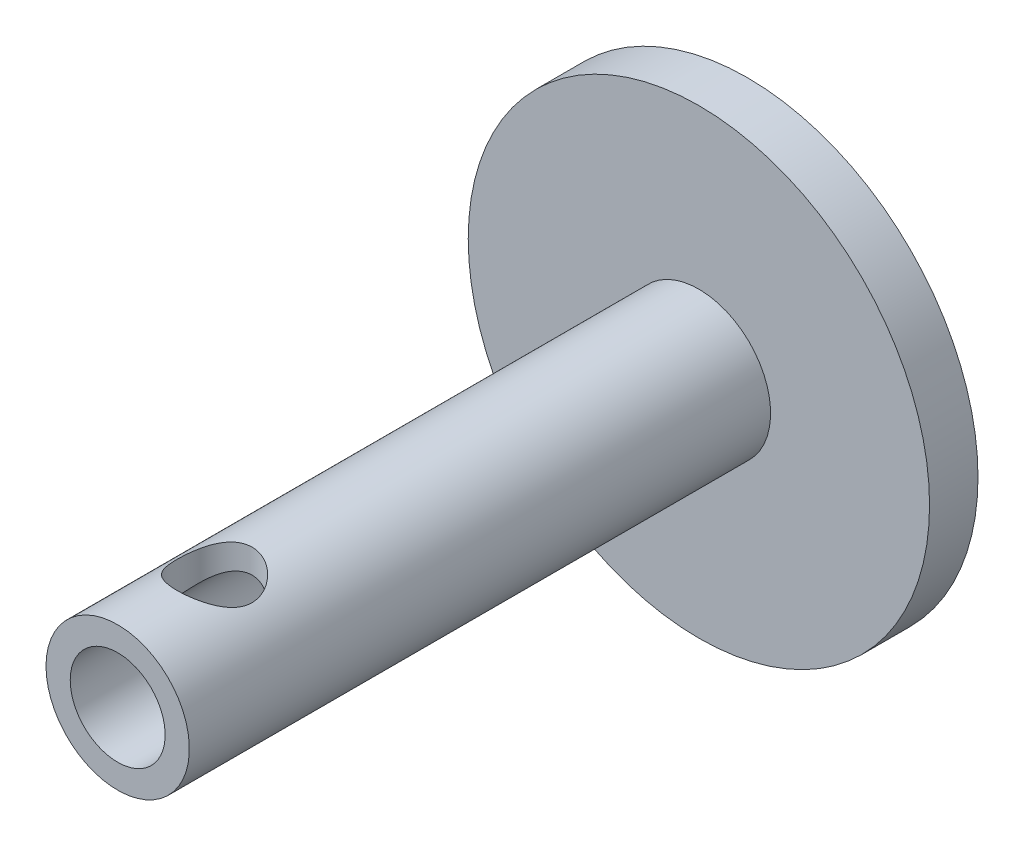
ISO-10303-21;
HEADER;
FILE_DESCRIPTION(('STEP AP214'),'2;1');
FILE_NAME('part.step','',(''),(''),'','','');
FILE_SCHEMA(('AUTOMOTIVE_DESIGN { 1 0 10303 214 1 1 1 1 }'));
ENDSEC;
DATA;
#1=APPLICATION_CONTEXT('core data for automotive mechanical design processes');
#2=APPLICATION_PROTOCOL_DEFINITION('international standard','automotive_design',2000,#1);
#3=PRODUCT_CONTEXT('',#1,'mechanical');
#4=PRODUCT('Part','Part','',(#3));
#5=PRODUCT_RELATED_PRODUCT_CATEGORY('part','',(#4));
#6=PRODUCT_DEFINITION_FORMATION('','',#4);
#7=PRODUCT_DEFINITION_CONTEXT('part definition',#1,'design');
#8=PRODUCT_DEFINITION('design','',#6,#7);
#9=PRODUCT_DEFINITION_SHAPE('','',#8);
#10=(LENGTH_UNIT() NAMED_UNIT(*) SI_UNIT(.MILLI.,.METRE.));
#11=(NAMED_UNIT(*) PLANE_ANGLE_UNIT() SI_UNIT($,.RADIAN.));
#12=(NAMED_UNIT(*) SI_UNIT($,.STERADIAN.) SOLID_ANGLE_UNIT());
#13=UNCERTAINTY_MEASURE_WITH_UNIT(LENGTH_MEASURE(1.E-05),#10,'distance_accuracy_value','');
#14=(GEOMETRIC_REPRESENTATION_CONTEXT(3) GLOBAL_UNCERTAINTY_ASSIGNED_CONTEXT((#13)) GLOBAL_UNIT_ASSIGNED_CONTEXT((#10,
#11,#12)) REPRESENTATION_CONTEXT('',''));
#15=CARTESIAN_POINT('',(0.,0.,0.));
#16=DIRECTION('',(0.,0.,1.));
#17=DIRECTION('',(1.,0.,0.));
#18=AXIS2_PLACEMENT_3D('',#15,#16,#17);
#19=CARTESIAN_POINT('',(2.96,0.,24.));
#20=DIRECTION('',(0.,0.,-1.));
#21=DIRECTION('',(-1.,0.,0.));
#22=AXIS2_PLACEMENT_3D('',#19,#20,#21);
#23=PLANE('',#22);
#24=CARTESIAN_POINT('',(0.,0.,24.));
#25=DIRECTION('',(0.,0.,-1.));
#26=DIRECTION('',(-1.,0.,0.));
#27=AXIS2_PLACEMENT_3D('',#24,#25,#26);
#28=CIRCLE('',#27,2.96);
#29=CARTESIAN_POINT('',(-2.96,0.,24.));
#30=VERTEX_POINT('',#29);
#31=EDGE_CURVE('E122',#30,#30,#28,.T.);
#32=ORIENTED_EDGE('',*,*,#31,.F.);
#33=EDGE_LOOP('',(#32));
#34=FACE_BOUND('',#33,.T.);
#35=CARTESIAN_POINT('',(0.,0.,24.));
#36=DIRECTION('',(0.,0.,-1.));
#37=DIRECTION('',(-1.,0.,0.));
#38=AXIS2_PLACEMENT_3D('',#35,#36,#37);
#39=CIRCLE('',#38,1.96);
#40=CARTESIAN_POINT('',(-1.96,0.,24.));
#41=VERTEX_POINT('',#40);
#42=EDGE_CURVE('E51',#41,#41,#39,.T.);
#43=ORIENTED_EDGE('',*,*,#42,.T.);
#44=EDGE_LOOP('',(#43));
#45=FACE_BOUND('',#44,.T.);
#46=ADVANCED_FACE('F40',(#34,#45),#23,.F.);
#47=CARTESIAN_POINT('',(0.,0.,-2.));
#48=DIRECTION('',(0.,0.,-1.));
#49=DIRECTION('',(-1.,0.,0.));
#50=AXIS2_PLACEMENT_3D('',#47,#48,#49);
#51=CYLINDRICAL_SURFACE('',#50,1.96);
#52=CARTESIAN_POINT('',(0.,-1.96,21.55));
#53=CARTESIAN_POINT('',(-0.0746568045734328,-1.95999397400661,21.5499937838936));
#54=CARTESIAN_POINT('',(-0.149405391044742,-1.95569132095657,21.544562636242));
#55=CARTESIAN_POINT('',(-0.296493778049111,-1.93886565327968,21.523201047049));
#56=CARTESIAN_POINT('',(-0.368828725940991,-1.92632701689851,21.5072506526988));
#57=CARTESIAN_POINT('',(-0.508578278205111,-1.89421707066767,21.4659895208645));
#58=CARTESIAN_POINT('',(-0.576020372064933,-1.87468942407518,21.4407368704287));
#59=CARTESIAN_POINT('',(-0.705199414167387,-1.83002053238323,21.3821120204705));
#60=CARTESIAN_POINT('',(-0.766935895288857,-1.8048788282329,21.3487391569535));
#61=CARTESIAN_POINT('',(-0.904156365864112,-1.74115210952124,21.2623935578558));
#62=CARTESIAN_POINT('',(-0.977110743456854,-1.70091151865726,21.2066222617887));
#63=CARTESIAN_POINT('',(-1.11115864773021,-1.61654700414325,21.0844759704547));
#64=CARTESIAN_POINT('',(-1.17221723465961,-1.57241217813069,21.018070752302));
#65=CARTESIAN_POINT('',(-1.28286906288937,-1.48355771556415,20.8746927321344));
#66=CARTESIAN_POINT('',(-1.33227708612719,-1.43883920943189,20.7975766803363));
#67=CARTESIAN_POINT('',(-1.41759039303436,-1.35483741094282,20.6335868593087));
#68=CARTESIAN_POINT('',(-1.45354186613012,-1.31553582416967,20.5467478230313));
#69=CARTESIAN_POINT('',(-1.49810764747785,-1.26408843541495,20.4016086105696));
#70=CARTESIAN_POINT('',(-1.51187011224514,-1.24745252027821,20.346506017504));
#71=CARTESIAN_POINT('',(-1.53336623458263,-1.22093472226132,20.2336109096542));
#72=CARTESIAN_POINT('',(-1.54111442409937,-1.21103656649417,20.1758252385064));
#73=CARTESIAN_POINT('',(-1.55002347780994,-1.19962031776102,20.0584108456369));
#74=CARTESIAN_POINT('',(-1.55113172169234,-1.19816916828634,19.9987711568037));
#75=CARTESIAN_POINT('',(-1.54650422373792,-1.20413213262265,19.8801851920153));
#76=CARTESIAN_POINT('',(-1.54076181518098,-1.21155488209317,19.821239647979));
#77=CARTESIAN_POINT('',(-1.52142261053495,-1.23577624089895,19.6959256483089));
#78=CARTESIAN_POINT('',(-1.50664638639496,-1.25396599656985,19.6300207096244));
#79=CARTESIAN_POINT('',(-1.46956571199885,-1.29722226068151,19.5027067436442));
#80=CARTESIAN_POINT('',(-1.44723961138571,-1.32230850666038,19.4413112712449));
#81=CARTESIAN_POINT('',(-1.38404978718874,-1.38886933009948,19.2958753970852));
#82=CARTESIAN_POINT('',(-1.33938897307981,-1.4325546162818,19.2145085550018));
#83=CARTESIAN_POINT('',(-1.23705792031506,-1.5218186659776,19.0615652845649));
#84=CARTESIAN_POINT('',(-1.17936997457548,-1.56739993715683,18.990002396929));
#85=CARTESIAN_POINT('',(-1.04991010592864,-1.65699357794198,18.8558587770496));
#86=CARTESIAN_POINT('',(-0.977858787770961,-1.70095015100397,18.7935076354175));
#87=CARTESIAN_POINT('',(-0.821011669328597,-1.78193160069085,18.6818012247973));
#88=CARTESIAN_POINT('',(-0.736251993269533,-1.81897547777325,18.6324101766437));
#89=CARTESIAN_POINT('',(-0.581953673262459,-1.87284042123239,18.5616725747236));
#90=CARTESIAN_POINT('',(-0.515192235655196,-1.89240825249774,18.536348186648));
#91=CARTESIAN_POINT('',(-0.377273322478689,-1.92464627299882,18.4948969822355));
#92=CARTESIAN_POINT('',(-0.306119239549992,-1.93732171312852,18.4787631637148));
#93=CARTESIAN_POINT('',(-0.160931569625636,-1.95475531922086,18.4566220759572));
#94=CARTESIAN_POINT('',(-0.0868861438551919,-1.9594764406653,18.4506621866267));
#95=CARTESIAN_POINT('',(0.0613495342411641,-1.96044038015338,18.44944299547));
#96=CARTESIAN_POINT('',(0.135539773324839,-1.95668394017379,18.4541827571842));
#97=CARTESIAN_POINT('',(0.276324492055145,-1.941622658479,18.4732947008915));
#98=CARTESIAN_POINT('',(0.343080918968177,-1.93088167713264,18.4869476274579));
#99=CARTESIAN_POINT('',(0.473030422831981,-1.90322347006205,18.5224065761335));
#100=CARTESIAN_POINT('',(0.536222640841211,-1.88630476284256,18.5442145539555));
#101=CARTESIAN_POINT('',(0.662300463497124,-1.84598188875173,18.5968406861929));
#102=CARTESIAN_POINT('',(0.724839795835135,-1.82219994143264,18.6281923958508));
#103=CARTESIAN_POINT('',(0.843809640618334,-1.77025589701434,18.6979828247569));
#104=CARTESIAN_POINT('',(0.900237633310264,-1.74209200477807,18.7364244497095));
#105=CARTESIAN_POINT('',(1.01692768467601,-1.6771204833665,18.82746220717));
#106=CARTESIAN_POINT('',(1.07582806197204,-1.63969366121743,18.8813582563146));
#107=CARTESIAN_POINT('',(1.18431282742519,-1.56314307759267,18.9969058529894));
#108=CARTESIAN_POINT('',(1.23388322316528,-1.52401687397117,19.0585688212165));
#109=CARTESIAN_POINT('',(1.32353712051407,-1.44684178531635,19.1894034107964));
#110=CARTESIAN_POINT('',(1.36359163960478,-1.40879649452822,19.2585970583685));
#111=CARTESIAN_POINT('',(1.43329823351036,-1.33780269161398,19.4044634815987));
#112=CARTESIAN_POINT('',(1.46297188601575,-1.30484368783682,19.4811203148722));
#113=CARTESIAN_POINT('',(1.50248210572275,-1.25886785837731,19.6150746422407));
#114=CARTESIAN_POINT('',(1.51563385438596,-1.24286337023177,19.6703456806742));
#115=CARTESIAN_POINT('',(1.5358702554781,-1.21777123190342,19.7834650416776));
#116=CARTESIAN_POINT('',(1.54296905353917,-1.20866746043867,19.8413070210128));
#117=CARTESIAN_POINT('',(1.55056637515719,-1.19891195875774,19.9585964683481));
#118=CARTESIAN_POINT('',(1.55101721439945,-1.19832129180803,20.0180524735773));
#119=CARTESIAN_POINT('',(1.54514822952953,-1.20587494217348,20.1360889072633));
#120=CARTESIAN_POINT('',(1.53882075342367,-1.21402913150841,20.1946682703142));
#121=CARTESIAN_POINT('',(1.51810185443092,-1.23987175645266,20.3204585604152));
#122=CARTESIAN_POINT('',(1.50237507783728,-1.25911326517056,20.3871162778129));
#123=CARTESIAN_POINT('',(1.46323804387194,-1.30438801138049,20.5157341753769));
#124=CARTESIAN_POINT('',(1.4398056179123,-1.33044079956737,20.5776801595336));
#125=CARTESIAN_POINT('',(1.3739479816869,-1.398934085708,20.7237330415505));
#126=CARTESIAN_POINT('',(1.32772885576577,-1.44344786557728,20.805147758159));
#127=CARTESIAN_POINT('',(1.22205832387067,-1.53396467161635,20.957970313221));
#128=CARTESIAN_POINT('',(1.16259043801103,-1.5799694910259,21.0293655067174));
#129=CARTESIAN_POINT('',(1.02953443191552,-1.669798334354,21.1625722627811));
#130=CARTESIAN_POINT('',(0.955711809535725,-1.71356832467262,21.2241885880312));
#131=CARTESIAN_POINT('',(0.795206175467304,-1.79366512293237,21.3339917231915));
#132=CARTESIAN_POINT('',(0.708557811018983,-1.83001137448076,21.3822137368566));
#133=CARTESIAN_POINT('',(0.55215301731591,-1.88184188956898,21.4500153225463));
#134=CARTESIAN_POINT('',(0.485214771208173,-1.90031102299481,21.4738466305747));
#135=CARTESIAN_POINT('',(0.347314191526358,-1.93026278317878,21.5122705249076));
#136=CARTESIAN_POINT('',(0.276362136333287,-1.94176244385527,21.5268856398566));
#137=CARTESIAN_POINT('',(0.170645383999779,-1.95285446914429,21.5409563628464));
#138=CARTESIAN_POINT('',(0.136670015642219,-1.95552715912689,21.544340784903));
#139=CARTESIAN_POINT('',(0.0684695750793971,-1.95910152680329,21.5488643083066));
#140=CARTESIAN_POINT('',(0.0342444428993153,-1.96000276407205,21.5500028512753));
#141=CARTESIAN_POINT('',(0.,-1.96,21.55));
#142=B_SPLINE_CURVE_WITH_KNOTS('',3,(#52,#53,#54,#55,#56,#57,#58,#59,#60,#61,#62,#63,#64,#65,
#66,#67,#68,#69,#70,#71,#72,#73,#74,#75,#76,#77,#78,#79,#80,#81,#82,#83,#84,#85,#86,#87,#88,#89,
#90,#91,#92,#93,#94,#95,#96,#97,#98,#99,#100,#101,#102,#103,#104,#105,#106,#107,#108,#109,#110,
#111,#112,#113,#114,#115,#116,#117,#118,#119,#120,#121,#122,#123,#124,#125,#126,#127,#128,#129,
#130,#131,#132,#133,#134,#135,#136,#137,#138,#139,#140,#141),.UNSPECIFIED.,.T.,.F.,(4,2,2,2,2,2,
2,2,2,2,2,2,2,2,2,2,2,2,2,2,2,2,2,2,2,2,2,2,2,2,2,2,2,2,2,2,2,2,2,2,2,2,2,2,4),(0.,
0.223822390491957,0.448070550970299,0.670941517565939,0.893830714576919,1.19302867155278,
1.49309259117372,1.79764617772282,2.10114458704691,2.27809844488372,2.45462339675225,
2.63254544440582,2.81064077843133,3.01931874555316,3.22860027413618,3.53476003424375,
3.84133847290558,4.15459449641266,4.46697638631227,4.68819018175373,4.90923521088235,
5.13130686471063,5.35335908304233,5.55939878140102,5.76548792311993,5.98634097752764,
6.20728474747541,6.47086783111493,6.73484312114158,6.99961237935605,7.26382797118496,
7.44028769732501,7.61633390122091,7.79364223570291,7.97115094348612,8.18338451240639,
8.39623408297929,8.70562472717819,9.01540238690673,9.33074584523785,9.64525248241206,
9.86462859306211,10.0834663466482,10.186106262863,10.2887716945619),.UNSPECIFIED.);
#143=CARTESIAN_POINT('',(0.,-1.96,21.55));
#144=VERTEX_POINT('',#143);
#145=EDGE_CURVE('E86',#144,#144,#142,.T.);
#146=ORIENTED_EDGE('',*,*,#145,.T.);
#147=EDGE_LOOP('',(#146));
#148=FACE_BOUND('',#147,.T.);
#149=CARTESIAN_POINT('',(0.,1.96,21.55));
#150=CARTESIAN_POINT('',(0.0746568045734328,1.95999397400661,21.5499937838936));
#151=CARTESIAN_POINT('',(0.149405391044742,1.95569132095657,21.544562636242));
#152=CARTESIAN_POINT('',(0.296493778049111,1.93886565327968,21.523201047049));
#153=CARTESIAN_POINT('',(0.368828725940991,1.92632701689851,21.5072506526988));
#154=CARTESIAN_POINT('',(0.508578278205111,1.89421707066767,21.4659895208645));
#155=CARTESIAN_POINT('',(0.576020372064933,1.87468942407518,21.4407368704287));
#156=CARTESIAN_POINT('',(0.705199414167387,1.83002053238323,21.3821120204705));
#157=CARTESIAN_POINT('',(0.766935895288857,1.8048788282329,21.3487391569535));
#158=CARTESIAN_POINT('',(0.904156365864112,1.74115210952124,21.2623935578558));
#159=CARTESIAN_POINT('',(0.977110743456854,1.70091151865726,21.2066222617887));
#160=CARTESIAN_POINT('',(1.11115864773021,1.61654700414325,21.0844759704547));
#161=CARTESIAN_POINT('',(1.17221723465961,1.57241217813069,21.018070752302));
#162=CARTESIAN_POINT('',(1.28286906288937,1.48355771556415,20.8746927321344));
#163=CARTESIAN_POINT('',(1.33227708612719,1.43883920943189,20.7975766803363));
#164=CARTESIAN_POINT('',(1.41759039303436,1.35483741094282,20.6335868593087));
#165=CARTESIAN_POINT('',(1.45354186613012,1.31553582416967,20.5467478230313));
#166=CARTESIAN_POINT('',(1.49810764747785,1.26408843541495,20.4016086105696));
#167=CARTESIAN_POINT('',(1.51187011224514,1.24745252027821,20.346506017504));
#168=CARTESIAN_POINT('',(1.53336623458263,1.22093472226132,20.2336109096542));
#169=CARTESIAN_POINT('',(1.54111442409937,1.21103656649417,20.1758252385064));
#170=CARTESIAN_POINT('',(1.55002347780994,1.19962031776102,20.0584108456369));
#171=CARTESIAN_POINT('',(1.55113172169234,1.19816916828634,19.9987711568037));
#172=CARTESIAN_POINT('',(1.54650422373792,1.20413213262265,19.8801851920153));
#173=CARTESIAN_POINT('',(1.54076181518098,1.21155488209317,19.821239647979));
#174=CARTESIAN_POINT('',(1.52142261053495,1.23577624089895,19.6959256483089));
#175=CARTESIAN_POINT('',(1.50664638639496,1.25396599656985,19.6300207096244));
#176=CARTESIAN_POINT('',(1.46956571199885,1.29722226068151,19.5027067436442));
#177=CARTESIAN_POINT('',(1.44723961138571,1.32230850666038,19.4413112712449));
#178=CARTESIAN_POINT('',(1.38404978718874,1.38886933009948,19.2958753970852));
#179=CARTESIAN_POINT('',(1.33938897307981,1.4325546162818,19.2145085550018));
#180=CARTESIAN_POINT('',(1.23705792031506,1.5218186659776,19.0615652845649));
#181=CARTESIAN_POINT('',(1.17936997457548,1.56739993715683,18.990002396929));
#182=CARTESIAN_POINT('',(1.04991010592864,1.65699357794198,18.8558587770496));
#183=CARTESIAN_POINT('',(0.977858787770961,1.70095015100397,18.7935076354175));
#184=CARTESIAN_POINT('',(0.821011669328597,1.78193160069085,18.6818012247973));
#185=CARTESIAN_POINT('',(0.736251993269533,1.81897547777325,18.6324101766437));
#186=CARTESIAN_POINT('',(0.581953673262459,1.87284042123239,18.5616725747236));
#187=CARTESIAN_POINT('',(0.515192235655196,1.89240825249774,18.536348186648));
#188=CARTESIAN_POINT('',(0.377273322478689,1.92464627299882,18.4948969822355));
#189=CARTESIAN_POINT('',(0.306119239549992,1.93732171312852,18.4787631637148));
#190=CARTESIAN_POINT('',(0.160931569625636,1.95475531922086,18.4566220759572));
#191=CARTESIAN_POINT('',(0.0868861438551919,1.9594764406653,18.4506621866267));
#192=CARTESIAN_POINT('',(-0.0613495342411641,1.96044038015338,18.44944299547));
#193=CARTESIAN_POINT('',(-0.135539773324839,1.95668394017379,18.4541827571842));
#194=CARTESIAN_POINT('',(-0.276324492055145,1.941622658479,18.4732947008915));
#195=CARTESIAN_POINT('',(-0.343080918968177,1.93088167713264,18.4869476274579));
#196=CARTESIAN_POINT('',(-0.473030422831981,1.90322347006205,18.5224065761335));
#197=CARTESIAN_POINT('',(-0.536222640841211,1.88630476284256,18.5442145539555));
#198=CARTESIAN_POINT('',(-0.662300463497124,1.84598188875173,18.5968406861929));
#199=CARTESIAN_POINT('',(-0.724839795835135,1.82219994143264,18.6281923958508));
#200=CARTESIAN_POINT('',(-0.843809640618334,1.77025589701434,18.6979828247569));
#201=CARTESIAN_POINT('',(-0.900237633310264,1.74209200477807,18.7364244497095));
#202=CARTESIAN_POINT('',(-1.01692768467601,1.6771204833665,18.82746220717));
#203=CARTESIAN_POINT('',(-1.07582806197204,1.63969366121743,18.8813582563146));
#204=CARTESIAN_POINT('',(-1.18431282742519,1.56314307759267,18.9969058529894));
#205=CARTESIAN_POINT('',(-1.23388322316528,1.52401687397117,19.0585688212165));
#206=CARTESIAN_POINT('',(-1.32353712051407,1.44684178531635,19.1894034107964));
#207=CARTESIAN_POINT('',(-1.36359163960478,1.40879649452822,19.2585970583685));
#208=CARTESIAN_POINT('',(-1.43329823351036,1.33780269161398,19.4044634815987));
#209=CARTESIAN_POINT('',(-1.46297188601575,1.30484368783682,19.4811203148722));
#210=CARTESIAN_POINT('',(-1.50248210572275,1.25886785837731,19.6150746422407));
#211=CARTESIAN_POINT('',(-1.51563385438596,1.24286337023177,19.6703456806742));
#212=CARTESIAN_POINT('',(-1.5358702554781,1.21777123190342,19.7834650416776));
#213=CARTESIAN_POINT('',(-1.54296905353917,1.20866746043867,19.8413070210128));
#214=CARTESIAN_POINT('',(-1.55056637515719,1.19891195875774,19.9585964683481));
#215=CARTESIAN_POINT('',(-1.55101721439945,1.19832129180803,20.0180524735773));
#216=CARTESIAN_POINT('',(-1.54514822952953,1.20587494217348,20.1360889072633));
#217=CARTESIAN_POINT('',(-1.53882075342367,1.21402913150841,20.1946682703142));
#218=CARTESIAN_POINT('',(-1.51810185443092,1.23987175645266,20.3204585604152));
#219=CARTESIAN_POINT('',(-1.50237507783728,1.25911326517056,20.3871162778129));
#220=CARTESIAN_POINT('',(-1.46323804387194,1.30438801138049,20.5157341753769));
#221=CARTESIAN_POINT('',(-1.4398056179123,1.33044079956737,20.5776801595336));
#222=CARTESIAN_POINT('',(-1.3739479816869,1.398934085708,20.7237330415505));
#223=CARTESIAN_POINT('',(-1.32772885576577,1.44344786557728,20.805147758159));
#224=CARTESIAN_POINT('',(-1.22205832387067,1.53396467161635,20.957970313221));
#225=CARTESIAN_POINT('',(-1.16259043801103,1.5799694910259,21.0293655067174));
#226=CARTESIAN_POINT('',(-1.02953443191552,1.669798334354,21.1625722627811));
#227=CARTESIAN_POINT('',(-0.955711809535725,1.71356832467262,21.2241885880312));
#228=CARTESIAN_POINT('',(-0.795206175467304,1.79366512293237,21.3339917231915));
#229=CARTESIAN_POINT('',(-0.708557811018983,1.83001137448076,21.3822137368566));
#230=CARTESIAN_POINT('',(-0.55215301731591,1.88184188956898,21.4500153225463));
#231=CARTESIAN_POINT('',(-0.485214771208173,1.90031102299481,21.4738466305747));
#232=CARTESIAN_POINT('',(-0.347314191526358,1.93026278317878,21.5122705249076));
#233=CARTESIAN_POINT('',(-0.276362136333287,1.94176244385527,21.5268856398566));
#234=CARTESIAN_POINT('',(-0.170645383999779,1.95285446914429,21.5409563628464));
#235=CARTESIAN_POINT('',(-0.136670015642219,1.95552715912689,21.544340784903));
#236=CARTESIAN_POINT('',(-0.0684695750793971,1.95910152680329,21.5488643083066));
#237=CARTESIAN_POINT('',(-0.0342444428993153,1.96000276407205,21.5500028512753));
#238=CARTESIAN_POINT('',(0.,1.96,21.55));
#239=B_SPLINE_CURVE_WITH_KNOTS('',3,(#149,#150,#151,#152,#153,#154,#155,#156,#157,#158,#159,
#160,#161,#162,#163,#164,#165,#166,#167,#168,#169,#170,#171,#172,#173,#174,#175,#176,#177,#178,
#179,#180,#181,#182,#183,#184,#185,#186,#187,#188,#189,#190,#191,#192,#193,#194,#195,#196,#197,
#198,#199,#200,#201,#202,#203,#204,#205,#206,#207,#208,#209,#210,#211,#212,#213,#214,#215,#216,
#217,#218,#219,#220,#221,#222,#223,#224,#225,#226,#227,#228,#229,#230,#231,#232,#233,#234,#235,
#236,#237,#238),.UNSPECIFIED.,.T.,.F.,(4,2,2,2,2,2,2,2,2,2,2,2,2,2,2,2,2,2,2,2,2,2,2,2,2,2,2,2,
2,2,2,2,2,2,2,2,2,2,2,2,2,2,2,2,4),(0.,0.223822390491957,0.448070550970299,0.670941517565939,
0.893830714576919,1.19302867155278,1.49309259117372,1.79764617772282,2.10114458704691,
2.27809844488372,2.45462339675225,2.63254544440582,2.81064077843133,3.01931874555316,
3.22860027413618,3.53476003424375,3.84133847290558,4.15459449641266,4.46697638631227,
4.68819018175373,4.90923521088235,5.13130686471063,5.35335908304233,5.55939878140102,
5.76548792311993,5.98634097752764,6.20728474747541,6.47086783111493,6.73484312114158,
6.99961237935605,7.26382797118496,7.44028769732501,7.61633390122091,7.79364223570291,
7.97115094348612,8.18338451240639,8.39623408297929,8.70562472717819,9.01540238690673,
9.33074584523785,9.64525248241206,9.86462859306211,10.0834663466482,10.186106262863,
10.2887716945619),.UNSPECIFIED.);
#240=CARTESIAN_POINT('',(0.,1.96,21.55));
#241=VERTEX_POINT('',#240);
#242=EDGE_CURVE('E68',#241,#241,#239,.T.);
#243=ORIENTED_EDGE('',*,*,#242,.T.);
#244=EDGE_LOOP('',(#243));
#245=FACE_BOUND('',#244,.T.);
#246=ORIENTED_EDGE('',*,*,#42,.F.);
#247=EDGE_LOOP('',(#246));
#248=FACE_BOUND('',#247,.T.);
#249=CARTESIAN_POINT('',(0.,0.,0.));
#250=DIRECTION('',(0.,0.,-1.));
#251=DIRECTION('',(-1.,0.,0.));
#252=AXIS2_PLACEMENT_3D('',#249,#250,#251);
#253=CIRCLE('',#252,1.96);
#254=CARTESIAN_POINT('',(-1.96,0.,0.));
#255=VERTEX_POINT('',#254);
#256=EDGE_CURVE('E55',#255,#255,#253,.T.);
#257=ORIENTED_EDGE('',*,*,#256,.T.);
#258=EDGE_LOOP('',(#257));
#259=FACE_BOUND('',#258,.T.);
#260=ADVANCED_FACE('F91',(#148,#245,#248,#259),#51,.F.);
#261=CARTESIAN_POINT('',(0.,0.,0.));
#262=DIRECTION('',(0.,0.,-1.));
#263=DIRECTION('',(-1.,0.,0.));
#264=AXIS2_PLACEMENT_3D('',#261,#262,#263);
#265=PLANE('',#264);
#266=ORIENTED_EDGE('',*,*,#256,.F.);
#267=EDGE_LOOP('',(#266));
#268=FACE_BOUND('',#267,.T.);
#269=ADVANCED_FACE('F95',(#268),#265,.F.);
#270=CARTESIAN_POINT('',(9.525,0.,-2.));
#271=DIRECTION('',(0.,0.,1.));
#272=DIRECTION('',(1.,0.,0.));
#273=AXIS2_PLACEMENT_3D('',#270,#271,#272);
#274=PLANE('',#273);
#275=CARTESIAN_POINT('',(0.,0.,-2.));
#276=DIRECTION('',(0.,0.,-1.));
#277=DIRECTION('',(-1.,0.,0.));
#278=AXIS2_PLACEMENT_3D('',#275,#276,#277);
#279=CIRCLE('',#278,9.525);
#280=CARTESIAN_POINT('',(-9.525,0.,-2.));
#281=VERTEX_POINT('',#280);
#282=EDGE_CURVE('E60',#281,#281,#279,.T.);
#283=ORIENTED_EDGE('',*,*,#282,.T.);
#284=EDGE_LOOP('',(#283));
#285=FACE_BOUND('',#284,.T.);
#286=ADVANCED_FACE('F100',(#285),#274,.F.);
#287=CARTESIAN_POINT('',(0.,0.,-2.));
#288=DIRECTION('',(0.,0.,-1.));
#289=DIRECTION('',(-1.,0.,0.));
#290=AXIS2_PLACEMENT_3D('',#287,#288,#289);
#291=CYLINDRICAL_SURFACE('',#290,9.525);
#292=ORIENTED_EDGE('',*,*,#282,.F.);
#293=EDGE_LOOP('',(#292));
#294=FACE_BOUND('',#293,.T.);
#295=CARTESIAN_POINT('',(0.,0.,0.));
#296=DIRECTION('',(0.,0.,-1.));
#297=DIRECTION('',(-1.,0.,0.));
#298=AXIS2_PLACEMENT_3D('',#295,#296,#297);
#299=CIRCLE('',#298,9.525);
#300=CARTESIAN_POINT('',(-9.525,0.,0.));
#301=VERTEX_POINT('',#300);
#302=EDGE_CURVE('E126',#301,#301,#299,.T.);
#303=ORIENTED_EDGE('',*,*,#302,.T.);
#304=EDGE_LOOP('',(#303));
#305=FACE_BOUND('',#304,.T.);
#306=ADVANCED_FACE('F104',(#294,#305),#291,.T.);
#307=CARTESIAN_POINT('',(2.96,0.,0.));
#308=DIRECTION('',(0.,0.,-1.));
#309=DIRECTION('',(-1.,0.,0.));
#310=AXIS2_PLACEMENT_3D('',#307,#308,#309);
#311=PLANE('',#310);
#312=ORIENTED_EDGE('',*,*,#302,.F.);
#313=EDGE_LOOP('',(#312));
#314=FACE_BOUND('',#313,.T.);
#315=CARTESIAN_POINT('',(0.,0.,0.));
#316=DIRECTION('',(0.,0.,-1.));
#317=DIRECTION('',(-1.,0.,0.));
#318=AXIS2_PLACEMENT_3D('',#315,#316,#317);
#319=CIRCLE('',#318,2.96);
#320=CARTESIAN_POINT('',(-2.96,0.,0.));
#321=VERTEX_POINT('',#320);
#322=EDGE_CURVE('E124',#321,#321,#319,.T.);
#323=ORIENTED_EDGE('',*,*,#322,.T.);
#324=EDGE_LOOP('',(#323));
#325=FACE_BOUND('',#324,.T.);
#326=ADVANCED_FACE('F107',(#314,#325),#311,.F.);
#327=CARTESIAN_POINT('',(0.,0.,-2.));
#328=DIRECTION('',(0.,0.,-1.));
#329=DIRECTION('',(-1.,0.,0.));
#330=AXIS2_PLACEMENT_3D('',#327,#328,#329);
#331=CYLINDRICAL_SURFACE('',#330,2.96);
#332=CARTESIAN_POINT('',(0.,2.96,21.55));
#333=CARTESIAN_POINT('',(-0.0810171395135503,2.95999533115435,21.5499947265557));
#334=CARTESIAN_POINT('',(-0.162116663168706,2.9566388950417,21.543610858466));
#335=CARTESIAN_POINT('',(-0.321889166480812,2.94354232594429,21.5183719014097));
#336=CARTESIAN_POINT('',(-0.400557908660041,2.93379163852076,21.4994961927662));
#337=CARTESIAN_POINT('',(-0.552920048430003,2.9089200490786,21.4502291984257));
#338=CARTESIAN_POINT('',(-0.626631989179587,2.89382065922645,21.4198840100139));
#339=CARTESIAN_POINT('',(-0.767792415298661,2.85961141044163,21.3487944797965));
#340=CARTESIAN_POINT('',(-0.83524101878606,2.84050162716162,21.3080503341554));
#341=CARTESIAN_POINT('',(-0.966851649095479,2.79854799381711,21.2143468588825));
#342=CARTESIAN_POINT('',(-1.03052118483292,2.77554280810172,21.1607692115467));
#343=CARTESIAN_POINT('',(-1.1484312756793,2.72887052924319,21.0442628034395));
#344=CARTESIAN_POINT('',(-1.20266389297826,2.70520289812517,20.9813262522055));
#345=CARTESIAN_POINT('',(-1.30491483596718,2.65748961913855,20.8413368567292));
#346=CARTESIAN_POINT('',(-1.35198039385981,2.63359061561128,20.7635319313293));
#347=CARTESIAN_POINT('',(-1.43216387275829,2.59086540377866,20.599751137927));
#348=CARTESIAN_POINT('',(-1.46529237279133,2.57203535177225,20.5137815283703));
#349=CARTESIAN_POINT('',(-1.51439837431097,2.54341622230837,20.3414826213718));
#350=CARTESIAN_POINT('',(-1.53131084211899,2.53313952682639,20.255505205673));
#351=CARTESIAN_POINT('',(-1.55033054771912,2.52155000947126,20.0813722084613));
#352=CARTESIAN_POINT('',(-1.55245518219728,2.5202266547704,19.9932193088471));
#353=CARTESIAN_POINT('',(-1.54252185118099,2.52630912488254,19.8300019563514));
#354=CARTESIAN_POINT('',(-1.53233057477897,2.53256631308847,19.7547699171728));
#355=CARTESIAN_POINT('',(-1.5013205856528,2.55107024433651,19.607295416655));
#356=CARTESIAN_POINT('',(-1.48049788606852,2.56331923427506,19.5350540878489));
#357=CARTESIAN_POINT('',(-1.42847609150421,2.59267441480444,19.3935573028387));
#358=CARTESIAN_POINT('',(-1.39705093297843,2.60988512168049,19.3244076825421));
#359=CARTESIAN_POINT('',(-1.32489800141728,2.64724280121728,19.1920175792963));
#360=CARTESIAN_POINT('',(-1.28416606951977,2.66739108511436,19.1287797559727));
#361=CARTESIAN_POINT('',(-1.1878783821195,2.71177646059649,19.0006302023301));
#362=CARTESIAN_POINT('',(-1.1310426705574,2.73618970186415,18.9367376936824));
#363=CARTESIAN_POINT('',(-1.00742128759221,2.78407948609411,18.8189423863039));
#364=CARTESIAN_POINT('',(-0.940629986917781,2.80755548952271,18.7650452783013));
#365=CARTESIAN_POINT('',(-0.794337292432813,2.85250675544516,18.6659256248454));
#366=CARTESIAN_POINT('',(-0.714336273159394,2.87379870903684,18.6213503936095));
#367=CARTESIAN_POINT('',(-0.546578871574584,2.91036009232787,18.5466727298467));
#368=CARTESIAN_POINT('',(-0.458829269518298,2.92563472468393,18.5165577898042));
#369=CARTESIAN_POINT('',(-0.28632582956013,2.94728677768838,18.4743210429366));
#370=CARTESIAN_POINT('',(-0.201986680746486,2.95432825884326,18.4608502921312));
#371=CARTESIAN_POINT('',(-0.0319663030084574,2.96104713223336,18.4479903763455));
#372=CARTESIAN_POINT('',(0.0537141679950577,2.96072854317366,18.4485935268128));
#373=CARTESIAN_POINT('',(0.216058560178736,2.95312586994766,18.4631585163103));
#374=CARTESIAN_POINT('',(0.292859846900535,2.94644847174965,18.4759568892606));
#375=CARTESIAN_POINT('',(0.443048627856313,2.92763347503959,18.5126582603396));
#376=CARTESIAN_POINT('',(0.516435760140906,2.91549529905558,18.5365624329045));
#377=CARTESIAN_POINT('',(0.659967427340726,2.88644225497815,18.5953232471914));
#378=CARTESIAN_POINT('',(0.729976834599322,2.86941068904798,18.6304501551996));
#379=CARTESIAN_POINT('',(0.863319402368357,2.83215112395648,18.7103380994694));
#380=CARTESIAN_POINT('',(0.926649858992642,2.8119218384586,18.7551030154169));
#381=CARTESIAN_POINT('',(1.05190739613021,2.76766190859985,18.8583981166235));
#382=CARTESIAN_POINT('',(1.1129882813954,2.74345516837961,18.9178803066341));
#383=CARTESIAN_POINT('',(1.22472224437397,2.69543346131896,19.0461654921706));
#384=CARTESIAN_POINT('',(1.27536637865543,2.6716188464416,19.1149763986258));
#385=CARTESIAN_POINT('',(1.36779018702571,2.62556277829511,19.2652240651816));
#386=CARTESIAN_POINT('',(1.40883225945587,2.60350841238038,19.3471772999712));
#387=CARTESIAN_POINT('',(1.47611398124788,2.56596788001719,19.5183248995869));
#388=CARTESIAN_POINT('',(1.50237424294204,2.55047257487936,19.6075089817754));
#389=CARTESIAN_POINT('',(1.53679349022912,2.52986821740538,19.7813094866186));
#390=CARTESIAN_POINT('',(1.54647251386676,2.52389108427051,19.8655186920572));
#391=CARTESIAN_POINT('',(1.55191595368924,2.52055030165555,20.034536736203));
#392=CARTESIAN_POINT('',(1.54768867484975,2.52318151118648,20.1193451868455));
#393=CARTESIAN_POINT('',(1.52689179488415,2.53580666419444,20.2769408267436));
#394=CARTESIAN_POINT('',(1.51177781057902,2.54493085812906,20.3499997389275));
#395=CARTESIAN_POINT('',(1.47156213896599,2.56839318238301,20.4924269625866));
#396=CARTESIAN_POINT('',(1.44645692674387,2.58273315267911,20.5617939617491));
#397=CARTESIAN_POINT('',(1.38515624187268,2.61614855620309,20.6999470656404));
#398=CARTESIAN_POINT('',(1.34834066854495,2.63547315134449,20.7683957864833));
#399=CARTESIAN_POINT('',(1.26530056973736,2.67633251876513,20.8986013593268));
#400=CARTESIAN_POINT('',(1.21907098705669,2.69786847589109,20.9603545870726));
#401=CARTESIAN_POINT('',(1.11107297796142,2.74427127733414,21.0842824743279));
#402=CARTESIAN_POINT('',(1.04804131440247,2.76918833248301,21.1453435884793));
#403=CARTESIAN_POINT('',(0.912046688559062,2.81690646043104,21.2563339541614));
#404=CARTESIAN_POINT('',(0.839077699465071,2.83970623491445,21.3062564014376));
#405=CARTESIAN_POINT('',(0.683262328814017,2.88121003571393,21.3942034723446));
#406=CARTESIAN_POINT('',(0.600256619187636,2.89982940357406,21.4319878847285));
#407=CARTESIAN_POINT('',(0.427885420799681,2.93020697853545,21.4925503985324));
#408=CARTESIAN_POINT('',(0.338538008583323,2.94198387278079,21.5153693934586));
#409=CARTESIAN_POINT('',(0.206810557519036,2.95305398733107,21.5367017205051));
#410=CARTESIAN_POINT('',(0.165657768760206,2.95565042258933,21.5416799215702));
#411=CARTESIAN_POINT('',(0.0830105357649678,2.95912464281805,21.5483304464234));
#412=CARTESIAN_POINT('',(0.0415160845278085,2.96000239248377,21.5500027023018));
#413=CARTESIAN_POINT('',(0.,2.96,21.55));
#414=B_SPLINE_CURVE_WITH_KNOTS('',3,(#332,#333,#334,#335,#336,#337,#338,#339,#340,#341,#342,
#343,#344,#345,#346,#347,#348,#349,#350,#351,#352,#353,#354,#355,#356,#357,#358,#359,#360,#361,
#362,#363,#364,#365,#366,#367,#368,#369,#370,#371,#372,#373,#374,#375,#376,#377,#378,#379,#380,
#381,#382,#383,#384,#385,#386,#387,#388,#389,#390,#391,#392,#393,#394,#395,#396,#397,#398,#399,
#400,#401,#402,#403,#404,#405,#406,#407,#408,#409,#410,#411,#412,#413),.UNSPECIFIED.,.T.,.F.,(4,
2,2,2,2,2,2,2,2,2,2,2,2,2,2,2,2,2,2,2,2,2,2,2,2,2,2,2,2,2,2,2,2,2,2,2,2,2,2,2,4),(0.,
0.242883655351514,0.48616923031967,0.728487231716105,0.970800662400619,1.22874136544429,
1.4868979959184,1.76754125780255,2.04797110929172,2.31103687283514,2.57379310846532,
2.80125564417285,3.02880354268713,3.26154692500363,3.49439451607694,3.76004494856388,
4.0258461638297,4.30639679725767,4.58670432764484,4.8423722092809,5.09790049584705,
5.331260549584,5.5646452867225,5.80413797651026,6.04372725258809,6.30848354431085,
6.57346577543958,6.85476001046006,7.13566101993294,7.38907022510568,7.64232811937983,
7.86683540949112,8.0914219762923,8.33075918142959,8.57022529917987,8.84267536649519,
9.11529141191092,9.39301061673884,9.66996774715969,9.7944274762858,9.91888976200141),.UNSPECIFIED.);
#415=CARTESIAN_POINT('',(0.,2.96,21.55));
#416=VERTEX_POINT('',#415);
#417=EDGE_CURVE('E10',#416,#416,#414,.T.);
#418=ORIENTED_EDGE('',*,*,#417,.T.);
#419=EDGE_LOOP('',(#418));
#420=FACE_BOUND('',#419,.T.);
#421=CARTESIAN_POINT('',(0.,-2.96,21.55));
#422=CARTESIAN_POINT('',(0.0810171395135503,-2.95999533115435,21.5499947265557));
#423=CARTESIAN_POINT('',(0.162116663168706,-2.9566388950417,21.543610858466));
#424=CARTESIAN_POINT('',(0.321889166480812,-2.94354232594429,21.5183719014097));
#425=CARTESIAN_POINT('',(0.400557908660041,-2.93379163852076,21.4994961927662));
#426=CARTESIAN_POINT('',(0.552920048430003,-2.9089200490786,21.4502291984257));
#427=CARTESIAN_POINT('',(0.626631989179587,-2.89382065922645,21.4198840100139));
#428=CARTESIAN_POINT('',(0.767792415298661,-2.85961141044163,21.3487944797965));
#429=CARTESIAN_POINT('',(0.83524101878606,-2.84050162716162,21.3080503341554));
#430=CARTESIAN_POINT('',(0.966851649095479,-2.79854799381711,21.2143468588825));
#431=CARTESIAN_POINT('',(1.03052118483292,-2.77554280810172,21.1607692115467));
#432=CARTESIAN_POINT('',(1.1484312756793,-2.72887052924319,21.0442628034395));
#433=CARTESIAN_POINT('',(1.20266389297826,-2.70520289812517,20.9813262522055));
#434=CARTESIAN_POINT('',(1.30491483596718,-2.65748961913855,20.8413368567292));
#435=CARTESIAN_POINT('',(1.35198039385981,-2.63359061561128,20.7635319313293));
#436=CARTESIAN_POINT('',(1.43216387275829,-2.59086540377866,20.599751137927));
#437=CARTESIAN_POINT('',(1.46529237279133,-2.57203535177225,20.5137815283703));
#438=CARTESIAN_POINT('',(1.51439837431097,-2.54341622230837,20.3414826213718));
#439=CARTESIAN_POINT('',(1.53131084211899,-2.53313952682639,20.255505205673));
#440=CARTESIAN_POINT('',(1.55033054771912,-2.52155000947126,20.0813722084613));
#441=CARTESIAN_POINT('',(1.55245518219728,-2.5202266547704,19.9932193088471));
#442=CARTESIAN_POINT('',(1.54252185118099,-2.52630912488254,19.8300019563514));
#443=CARTESIAN_POINT('',(1.53233057477897,-2.53256631308847,19.7547699171728));
#444=CARTESIAN_POINT('',(1.5013205856528,-2.55107024433651,19.607295416655));
#445=CARTESIAN_POINT('',(1.48049788606852,-2.56331923427506,19.5350540878489));
#446=CARTESIAN_POINT('',(1.42847609150421,-2.59267441480444,19.3935573028387));
#447=CARTESIAN_POINT('',(1.39705093297843,-2.60988512168049,19.3244076825421));
#448=CARTESIAN_POINT('',(1.32489800141728,-2.64724280121728,19.1920175792963));
#449=CARTESIAN_POINT('',(1.28416606951977,-2.66739108511436,19.1287797559727));
#450=CARTESIAN_POINT('',(1.1878783821195,-2.71177646059649,19.0006302023301));
#451=CARTESIAN_POINT('',(1.1310426705574,-2.73618970186415,18.9367376936824));
#452=CARTESIAN_POINT('',(1.00742128759221,-2.78407948609411,18.8189423863039));
#453=CARTESIAN_POINT('',(0.940629986917781,-2.80755548952271,18.7650452783013));
#454=CARTESIAN_POINT('',(0.794337292432813,-2.85250675544516,18.6659256248454));
#455=CARTESIAN_POINT('',(0.714336273159394,-2.87379870903684,18.6213503936095));
#456=CARTESIAN_POINT('',(0.546578871574584,-2.91036009232787,18.5466727298467));
#457=CARTESIAN_POINT('',(0.458829269518298,-2.92563472468393,18.5165577898042));
#458=CARTESIAN_POINT('',(0.28632582956013,-2.94728677768838,18.4743210429366));
#459=CARTESIAN_POINT('',(0.201986680746486,-2.95432825884326,18.4608502921312));
#460=CARTESIAN_POINT('',(0.0319663030084574,-2.96104713223336,18.4479903763455));
#461=CARTESIAN_POINT('',(-0.0537141679950577,-2.96072854317366,18.4485935268128));
#462=CARTESIAN_POINT('',(-0.216058560178736,-2.95312586994766,18.4631585163103));
#463=CARTESIAN_POINT('',(-0.292859846900535,-2.94644847174965,18.4759568892606));
#464=CARTESIAN_POINT('',(-0.443048627856313,-2.92763347503959,18.5126582603396));
#465=CARTESIAN_POINT('',(-0.516435760140906,-2.91549529905558,18.5365624329045));
#466=CARTESIAN_POINT('',(-0.659967427340726,-2.88644225497815,18.5953232471914));
#467=CARTESIAN_POINT('',(-0.729976834599322,-2.86941068904798,18.6304501551996));
#468=CARTESIAN_POINT('',(-0.863319402368357,-2.83215112395648,18.7103380994694));
#469=CARTESIAN_POINT('',(-0.926649858992642,-2.8119218384586,18.7551030154169));
#470=CARTESIAN_POINT('',(-1.05190739613021,-2.76766190859985,18.8583981166235));
#471=CARTESIAN_POINT('',(-1.1129882813954,-2.74345516837961,18.9178803066341));
#472=CARTESIAN_POINT('',(-1.22472224437397,-2.69543346131896,19.0461654921706));
#473=CARTESIAN_POINT('',(-1.27536637865543,-2.6716188464416,19.1149763986258));
#474=CARTESIAN_POINT('',(-1.36779018702571,-2.62556277829511,19.2652240651816));
#475=CARTESIAN_POINT('',(-1.40883225945587,-2.60350841238038,19.3471772999712));
#476=CARTESIAN_POINT('',(-1.47611398124788,-2.56596788001719,19.5183248995869));
#477=CARTESIAN_POINT('',(-1.50237424294204,-2.55047257487936,19.6075089817754));
#478=CARTESIAN_POINT('',(-1.53679349022912,-2.52986821740538,19.7813094866186));
#479=CARTESIAN_POINT('',(-1.54647251386676,-2.52389108427051,19.8655186920572));
#480=CARTESIAN_POINT('',(-1.55191595368924,-2.52055030165555,20.034536736203));
#481=CARTESIAN_POINT('',(-1.54768867484975,-2.52318151118648,20.1193451868455));
#482=CARTESIAN_POINT('',(-1.52689179488415,-2.53580666419444,20.2769408267436));
#483=CARTESIAN_POINT('',(-1.51177781057902,-2.54493085812906,20.3499997389275));
#484=CARTESIAN_POINT('',(-1.47156213896599,-2.56839318238301,20.4924269625866));
#485=CARTESIAN_POINT('',(-1.44645692674387,-2.58273315267911,20.5617939617491));
#486=CARTESIAN_POINT('',(-1.38515624187268,-2.61614855620309,20.6999470656404));
#487=CARTESIAN_POINT('',(-1.34834066854495,-2.63547315134449,20.7683957864833));
#488=CARTESIAN_POINT('',(-1.26530056973736,-2.67633251876513,20.8986013593268));
#489=CARTESIAN_POINT('',(-1.21907098705669,-2.69786847589109,20.9603545870726));
#490=CARTESIAN_POINT('',(-1.11107297796142,-2.74427127733414,21.0842824743279));
#491=CARTESIAN_POINT('',(-1.04804131440247,-2.76918833248301,21.1453435884793));
#492=CARTESIAN_POINT('',(-0.912046688559062,-2.81690646043104,21.2563339541614));
#493=CARTESIAN_POINT('',(-0.839077699465071,-2.83970623491445,21.3062564014376));
#494=CARTESIAN_POINT('',(-0.683262328814017,-2.88121003571393,21.3942034723446));
#495=CARTESIAN_POINT('',(-0.600256619187636,-2.89982940357406,21.4319878847285));
#496=CARTESIAN_POINT('',(-0.427885420799681,-2.93020697853545,21.4925503985324));
#497=CARTESIAN_POINT('',(-0.338538008583323,-2.94198387278079,21.5153693934586));
#498=CARTESIAN_POINT('',(-0.206810557519036,-2.95305398733107,21.5367017205051));
#499=CARTESIAN_POINT('',(-0.165657768760206,-2.95565042258933,21.5416799215702));
#500=CARTESIAN_POINT('',(-0.0830105357649678,-2.95912464281805,21.5483304464234));
#501=CARTESIAN_POINT('',(-0.0415160845278085,-2.96000239248377,21.5500027023018));
#502=CARTESIAN_POINT('',(0.,-2.96,21.55));
#503=B_SPLINE_CURVE_WITH_KNOTS('',3,(#421,#422,#423,#424,#425,#426,#427,#428,#429,#430,#431,
#432,#433,#434,#435,#436,#437,#438,#439,#440,#441,#442,#443,#444,#445,#446,#447,#448,#449,#450,
#451,#452,#453,#454,#455,#456,#457,#458,#459,#460,#461,#462,#463,#464,#465,#466,#467,#468,#469,
#470,#471,#472,#473,#474,#475,#476,#477,#478,#479,#480,#481,#482,#483,#484,#485,#486,#487,#488,
#489,#490,#491,#492,#493,#494,#495,#496,#497,#498,#499,#500,#501,#502),.UNSPECIFIED.,.T.,.F.,(4,
2,2,2,2,2,2,2,2,2,2,2,2,2,2,2,2,2,2,2,2,2,2,2,2,2,2,2,2,2,2,2,2,2,2,2,2,2,2,2,4),(0.,
0.242883655351514,0.48616923031967,0.728487231716105,0.970800662400619,1.22874136544429,
1.4868979959184,1.76754125780255,2.04797110929172,2.31103687283514,2.57379310846532,
2.80125564417285,3.02880354268713,3.26154692500363,3.49439451607694,3.76004494856388,
4.0258461638297,4.30639679725767,4.58670432764484,4.8423722092809,5.09790049584705,
5.331260549584,5.5646452867225,5.80413797651026,6.04372725258809,6.30848354431085,
6.57346577543958,6.85476001046006,7.13566101993294,7.38907022510568,7.64232811937983,
7.86683540949112,8.0914219762923,8.33075918142959,8.57022529917987,8.84267536649519,
9.11529141191092,9.39301061673884,9.66996774715969,9.7944274762858,9.91888976200141),.UNSPECIFIED.);
#504=CARTESIAN_POINT('',(0.,-2.96,21.55));
#505=VERTEX_POINT('',#504);
#506=EDGE_CURVE('E63',#505,#505,#503,.T.);
#507=ORIENTED_EDGE('',*,*,#506,.T.);
#508=EDGE_LOOP('',(#507));
#509=FACE_BOUND('',#508,.T.);
#510=ORIENTED_EDGE('',*,*,#322,.F.);
#511=EDGE_LOOP('',(#510));
#512=FACE_BOUND('',#511,.T.);
#513=ORIENTED_EDGE('',*,*,#31,.T.);
#514=EDGE_LOOP('',(#513));
#515=FACE_BOUND('',#514,.T.);
#516=ADVANCED_FACE('F69',(#420,#509,#512,#515),#331,.T.);
#517=CARTESIAN_POINT('',(0.,2.96,20.));
#518=DIRECTION('',(0.,1.,0.));
#519=DIRECTION('',(0.,0.,1.));
#520=AXIS2_PLACEMENT_3D('',#517,#518,#519);
#521=CYLINDRICAL_SURFACE('',#520,1.55);
#522=ORIENTED_EDGE('',*,*,#506,.F.);
#523=EDGE_LOOP('',(#522));
#524=FACE_BOUND('',#523,.T.);
#525=ORIENTED_EDGE('',*,*,#145,.F.);
#526=EDGE_LOOP('',(#525));
#527=FACE_BOUND('',#526,.T.);
#528=ADVANCED_FACE('F72',(#524,#527),#521,.F.);
#529=ORIENTED_EDGE('',*,*,#417,.F.);
#530=EDGE_LOOP('',(#529));
#531=FACE_BOUND('',#530,.T.);
#532=ORIENTED_EDGE('',*,*,#242,.F.);
#533=EDGE_LOOP('',(#532));
#534=FACE_BOUND('',#533,.T.);
#535=ADVANCED_FACE('F75',(#531,#534),#521,.F.);
#536=CLOSED_SHELL('',(#46,#260,#269,#286,#306,#326,#516,#528,#535));
#537=MANIFOLD_SOLID_BREP('B2',#536);
#538=ADVANCED_BREP_SHAPE_REPRESENTATION('',(#18,#537),#14);
#539=SHAPE_DEFINITION_REPRESENTATION(#9,#538);
ENDSEC;
END-ISO-10303-21;
